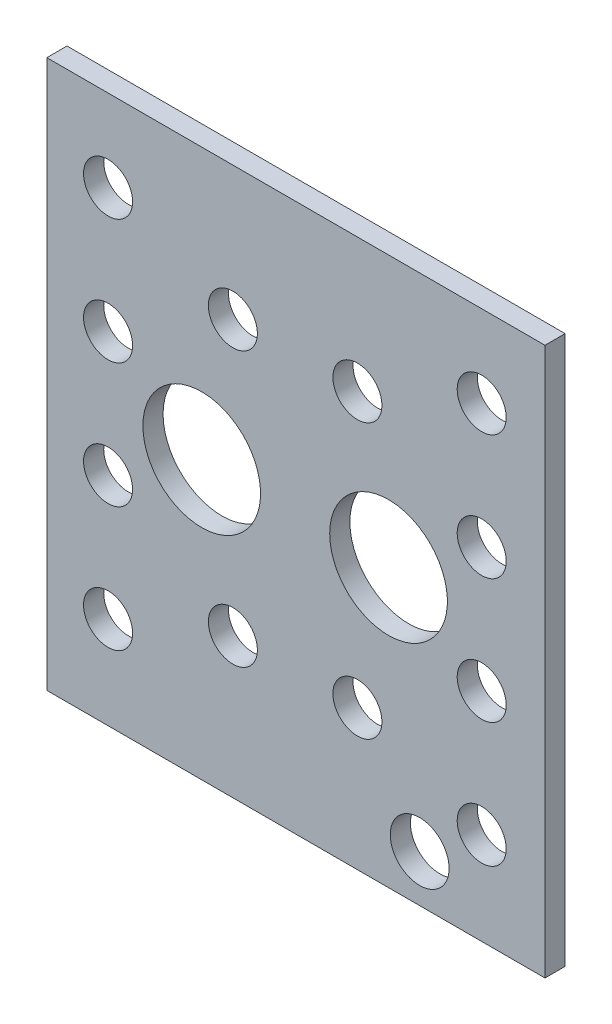
ISO-10303-21;
HEADER;
FILE_DESCRIPTION(('STEP AP214'),'2;1');
FILE_NAME('part.step','',(''),(''),'','','');
FILE_SCHEMA(('AUTOMOTIVE_DESIGN { 1 0 10303 214 1 1 1 1 }'));
ENDSEC;
DATA;
#1=APPLICATION_CONTEXT('core data for automotive mechanical design processes');
#2=APPLICATION_PROTOCOL_DEFINITION('international standard','automotive_design',2000,#1);
#3=PRODUCT_CONTEXT('',#1,'mechanical');
#4=PRODUCT('Part','Part','',(#3));
#5=PRODUCT_RELATED_PRODUCT_CATEGORY('part','',(#4));
#6=PRODUCT_DEFINITION_FORMATION('','',#4);
#7=PRODUCT_DEFINITION_CONTEXT('part definition',#1,'design');
#8=PRODUCT_DEFINITION('design','',#6,#7);
#9=PRODUCT_DEFINITION_SHAPE('','',#8);
#10=(LENGTH_UNIT() NAMED_UNIT(*) SI_UNIT(.MILLI.,.METRE.));
#11=(NAMED_UNIT(*) PLANE_ANGLE_UNIT() SI_UNIT($,.RADIAN.));
#12=(NAMED_UNIT(*) SI_UNIT($,.STERADIAN.) SOLID_ANGLE_UNIT());
#13=UNCERTAINTY_MEASURE_WITH_UNIT(LENGTH_MEASURE(1.E-05),#10,'distance_accuracy_value','');
#14=(GEOMETRIC_REPRESENTATION_CONTEXT(3) GLOBAL_UNCERTAINTY_ASSIGNED_CONTEXT((#13)) GLOBAL_UNIT_ASSIGNED_CONTEXT((#10,
#11,#12)) REPRESENTATION_CONTEXT('',''));
#15=CARTESIAN_POINT('',(0.,0.,0.));
#16=DIRECTION('',(0.,0.,1.));
#17=DIRECTION('',(1.,0.,0.));
#18=AXIS2_PLACEMENT_3D('',#15,#16,#17);
#19=CARTESIAN_POINT('',(-7.112,-5.588,0.));
#20=DIRECTION('',(0.,0.,1.));
#21=DIRECTION('',(1.,0.,0.));
#22=AXIS2_PLACEMENT_3D('',#19,#20,#21);
#23=PLANE('',#22);
#24=CARTESIAN_POINT('',(1.75699928,3.91599928,0.));
#25=DIRECTION('',(0.,0.,-1.));
#26=DIRECTION('',(-1.,0.,0.));
#27=AXIS2_PLACEMENT_3D('',#24,#25,#26);
#28=CIRCLE('',#27,0.499999);
#29=CARTESIAN_POINT('',(1.25700028,3.91599928,0.));
#30=VERTEX_POINT('',#29);
#31=EDGE_CURVE('E126',#30,#30,#28,.T.);
#32=ORIENTED_EDGE('',*,*,#31,.T.);
#33=EDGE_LOOP('',(#32));
#34=FACE_BOUND('',#33,.T.);
#35=CARTESIAN_POINT('',(1.75699928,1.37599928,0.));
#36=DIRECTION('',(0.,0.,-1.));
#37=DIRECTION('',(-1.,0.,0.));
#38=AXIS2_PLACEMENT_3D('',#35,#36,#37);
#39=CIRCLE('',#38,0.499999);
#40=CARTESIAN_POINT('',(1.25700028,1.37599928,0.));
#41=VERTEX_POINT('',#40);
#42=EDGE_CURVE('E129',#41,#41,#39,.T.);
#43=ORIENTED_EDGE('',*,*,#42,.T.);
#44=EDGE_LOOP('',(#43));
#45=FACE_BOUND('',#44,.T.);
#46=CARTESIAN_POINT('',(-0.77799946,2.86100012,0.));
#47=DIRECTION('',(0.,0.,-1.));
#48=DIRECTION('',(-1.,0.,0.));
#49=AXIS2_PLACEMENT_3D('',#46,#47,#48);
#50=CIRCLE('',#49,0.499999);
#51=CARTESIAN_POINT('',(-1.27799846,2.86100012,0.));
#52=VERTEX_POINT('',#51);
#53=EDGE_CURVE('E132',#52,#52,#50,.T.);
#54=ORIENTED_EDGE('',*,*,#53,.T.);
#55=EDGE_LOOP('',(#54));
#56=FACE_BOUND('',#55,.T.);
#57=CARTESIAN_POINT('',(-0.14299946,0.06700012,0.));
#58=DIRECTION('',(0.,0.,-1.));
#59=DIRECTION('',(-1.,0.,0.));
#60=AXIS2_PLACEMENT_3D('',#57,#58,#59);
#61=CIRCLE('',#60,1.20000014);
#62=CARTESIAN_POINT('',(-1.3429996,0.06700012,0.));
#63=VERTEX_POINT('',#62);
#64=EDGE_CURVE('E135',#63,#63,#61,.T.);
#65=ORIENTED_EDGE('',*,*,#64,.T.);
#66=EDGE_LOOP('',(#65));
#67=FACE_BOUND('',#66,.T.);
#68=CARTESIAN_POINT('',(1.75699928,-1.16400072,0.));
#69=DIRECTION('',(0.,0.,-1.));
#70=DIRECTION('',(-1.,0.,0.));
#71=AXIS2_PLACEMENT_3D('',#68,#69,#70);
#72=CIRCLE('',#71,0.499999);
#73=CARTESIAN_POINT('',(1.25700028,-1.16400072,0.));
#74=VERTEX_POINT('',#73);
#75=EDGE_CURVE('E138',#74,#74,#72,.T.);
#76=ORIENTED_EDGE('',*,*,#75,.T.);
#77=EDGE_LOOP('',(#76));
#78=FACE_BOUND('',#77,.T.);
#79=CARTESIAN_POINT('',(1.75699928,-3.70400072,0.));
#80=DIRECTION('',(0.,0.,-1.));
#81=DIRECTION('',(-1.,0.,0.));
#82=AXIS2_PLACEMENT_3D('',#79,#80,#81);
#83=CIRCLE('',#82,0.499999);
#84=CARTESIAN_POINT('',(1.25700028,-3.70400072,0.));
#85=VERTEX_POINT('',#84);
#86=EDGE_CURVE('E141',#85,#85,#83,.T.);
#87=ORIENTED_EDGE('',*,*,#86,.T.);
#88=EDGE_LOOP('',(#87));
#89=FACE_BOUND('',#88,.T.);
#90=CARTESIAN_POINT('',(-0.77799946,-2.72699988,0.));
#91=DIRECTION('',(0.,0.,-1.));
#92=DIRECTION('',(-1.,0.,0.));
#93=AXIS2_PLACEMENT_3D('',#90,#91,#92);
#94=CIRCLE('',#93,0.499999);
#95=CARTESIAN_POINT('',(-1.27799846,-2.72699988,0.));
#96=VERTEX_POINT('',#95);
#97=EDGE_CURVE('E144',#96,#96,#94,.T.);
#98=ORIENTED_EDGE('',*,*,#97,.T.);
#99=EDGE_LOOP('',(#98));
#100=FACE_BOUND('',#99,.T.);
#101=CARTESIAN_POINT('',(0.49200054,-4.63199988,0.));
#102=DIRECTION('',(0.,0.,-1.));
#103=DIRECTION('',(-1.,0.,0.));
#104=AXIS2_PLACEMENT_3D('',#101,#102,#103);
#105=CIRCLE('',#104,0.5999988);
#106=CARTESIAN_POINT('',(-0.10799826,-4.63199988,0.));
#107=VERTEX_POINT('',#106);
#108=EDGE_CURVE('E147',#107,#107,#105,.T.);
#109=ORIENTED_EDGE('',*,*,#108,.T.);
#110=EDGE_LOOP('',(#109));
#111=FACE_BOUND('',#110,.T.);
#112=CARTESIAN_POINT('',(-3.31799946,2.86100012,0.));
#113=DIRECTION('',(0.,0.,-1.));
#114=DIRECTION('',(-1.,0.,0.));
#115=AXIS2_PLACEMENT_3D('',#112,#113,#114);
#116=CIRCLE('',#115,0.499999);
#117=CARTESIAN_POINT('',(-3.81799846,2.86100012,0.));
#118=VERTEX_POINT('',#117);
#119=EDGE_CURVE('E150',#118,#118,#116,.T.);
#120=ORIENTED_EDGE('',*,*,#119,.T.);
#121=EDGE_LOOP('',(#120));
#122=FACE_BOUND('',#121,.T.);
#123=CARTESIAN_POINT('',(-3.95299946,0.06700012,0.));
#124=DIRECTION('',(0.,0.,-1.));
#125=DIRECTION('',(-1.,0.,0.));
#126=AXIS2_PLACEMENT_3D('',#123,#124,#125);
#127=CIRCLE('',#126,1.20000014);
#128=CARTESIAN_POINT('',(-5.1529996,0.06700012,0.));
#129=VERTEX_POINT('',#128);
#130=EDGE_CURVE('E154',#129,#129,#127,.T.);
#131=ORIENTED_EDGE('',*,*,#130,.T.);
#132=EDGE_LOOP('',(#131));
#133=FACE_BOUND('',#132,.T.);
#134=CARTESIAN_POINT('',(-5.86300072,3.91599928,0.));
#135=DIRECTION('',(0.,0.,-1.));
#136=DIRECTION('',(-1.,0.,0.));
#137=AXIS2_PLACEMENT_3D('',#134,#135,#136);
#138=CIRCLE('',#137,0.499999);
#139=CARTESIAN_POINT('',(-6.36299972,3.91599928,0.));
#140=VERTEX_POINT('',#139);
#141=EDGE_CURVE('E157',#140,#140,#138,.T.);
#142=ORIENTED_EDGE('',*,*,#141,.T.);
#143=EDGE_LOOP('',(#142));
#144=FACE_BOUND('',#143,.T.);
#145=CARTESIAN_POINT('',(-5.86300072,1.37599928,0.));
#146=DIRECTION('',(0.,0.,-1.));
#147=DIRECTION('',(-1.,0.,0.));
#148=AXIS2_PLACEMENT_3D('',#145,#146,#147);
#149=CIRCLE('',#148,0.499999);
#150=CARTESIAN_POINT('',(-6.36299972,1.37599928,0.));
#151=VERTEX_POINT('',#150);
#152=EDGE_CURVE('E160',#151,#151,#149,.T.);
#153=ORIENTED_EDGE('',*,*,#152,.T.);
#154=EDGE_LOOP('',(#153));
#155=FACE_BOUND('',#154,.T.);
#156=CARTESIAN_POINT('',(-5.86300072,-1.16400072,0.));
#157=DIRECTION('',(0.,0.,-1.));
#158=DIRECTION('',(-1.,0.,0.));
#159=AXIS2_PLACEMENT_3D('',#156,#157,#158);
#160=CIRCLE('',#159,0.499999);
#161=CARTESIAN_POINT('',(-6.36299972,-1.16400072,0.));
#162=VERTEX_POINT('',#161);
#163=EDGE_CURVE('E163',#162,#162,#160,.T.);
#164=ORIENTED_EDGE('',*,*,#163,.T.);
#165=EDGE_LOOP('',(#164));
#166=FACE_BOUND('',#165,.T.);
#167=CARTESIAN_POINT('',(-3.31799946,-2.72699988,0.));
#168=DIRECTION('',(0.,0.,-1.));
#169=DIRECTION('',(-1.,0.,0.));
#170=AXIS2_PLACEMENT_3D('',#167,#168,#169);
#171=CIRCLE('',#170,0.499999);
#172=CARTESIAN_POINT('',(-3.81799846,-2.72699988,0.));
#173=VERTEX_POINT('',#172);
#174=EDGE_CURVE('E165',#173,#173,#171,.T.);
#175=ORIENTED_EDGE('',*,*,#174,.T.);
#176=EDGE_LOOP('',(#175));
#177=FACE_BOUND('',#176,.T.);
#178=CARTESIAN_POINT('',(-5.86300072,-3.70400072,0.));
#179=DIRECTION('',(0.,0.,-1.));
#180=DIRECTION('',(-1.,0.,0.));
#181=AXIS2_PLACEMENT_3D('',#178,#179,#180);
#182=CIRCLE('',#181,0.499999);
#183=CARTESIAN_POINT('',(-6.36299972,-3.70400072,0.));
#184=VERTEX_POINT('',#183);
#185=EDGE_CURVE('E19',#184,#184,#182,.T.);
#186=ORIENTED_EDGE('',*,*,#185,.T.);
#187=EDGE_LOOP('',(#186));
#188=FACE_BOUND('',#187,.T.);
#189=DIRECTION('',(1.,0.,0.));
#190=VECTOR('',#189,1.);
#191=CARTESIAN_POINT('',(-7.112,5.588,0.));
#192=LINE('',#191,#190);
#193=CARTESIAN_POINT('',(-7.112,5.588,0.));
#194=VERTEX_POINT('',#193);
#195=CARTESIAN_POINT('',(3.048,5.588,0.));
#196=VERTEX_POINT('',#195);
#197=EDGE_CURVE('E53',#194,#196,#192,.T.);
#198=ORIENTED_EDGE('',*,*,#197,.F.);
#199=DIRECTION('',(0.,1.,0.));
#200=VECTOR('',#199,1.);
#201=CARTESIAN_POINT('',(-7.112,-5.588,0.));
#202=LINE('',#201,#200);
#203=CARTESIAN_POINT('',(-7.112,-5.588,0.));
#204=VERTEX_POINT('',#203);
#205=EDGE_CURVE('E70',#204,#194,#202,.T.);
#206=ORIENTED_EDGE('',*,*,#205,.F.);
#207=DIRECTION('',(1.,0.,0.));
#208=VECTOR('',#207,1.);
#209=CARTESIAN_POINT('',(3.048,-5.588,0.));
#210=LINE('',#209,#208);
#211=CARTESIAN_POINT('',(3.048,-5.588,0.));
#212=VERTEX_POINT('',#211);
#213=EDGE_CURVE('E67',#212,#204,#210,.F.);
#214=ORIENTED_EDGE('',*,*,#213,.F.);
#215=DIRECTION('',(0.,1.,0.));
#216=VECTOR('',#215,1.);
#217=CARTESIAN_POINT('',(3.048,5.588,0.));
#218=LINE('',#217,#216);
#219=EDGE_CURVE('E58',#196,#212,#218,.F.);
#220=ORIENTED_EDGE('',*,*,#219,.F.);
#221=EDGE_LOOP('',(#198,#206,#214,#220));
#222=FACE_BOUND('',#221,.T.);
#223=ADVANCED_FACE('F16',(#34,#45,#56,#67,#78,#89,#100,#111,#122,#133,#144,#155,#166,#177,#188,
#222),#23,.T.);
#224=CARTESIAN_POINT('',(3.048,-5.588,-0.41148));
#225=DIRECTION('',(0.,-1.,0.));
#226=DIRECTION('',(0.,0.,-1.));
#227=AXIS2_PLACEMENT_3D('',#224,#225,#226);
#228=PLANE('',#227);
#229=DIRECTION('',(0.,0.,1.));
#230=VECTOR('',#229,1.);
#231=CARTESIAN_POINT('',(-7.112,-5.588,-0.41148));
#232=LINE('',#231,#230);
#233=CARTESIAN_POINT('',(-7.112,-5.588,-0.41148));
#234=VERTEX_POINT('',#233);
#235=EDGE_CURVE('E173',#234,#204,#232,.T.);
#236=ORIENTED_EDGE('',*,*,#235,.F.);
#237=DIRECTION('',(1.,0.,0.));
#238=VECTOR('',#237,1.);
#239=CARTESIAN_POINT('',(-7.112,-5.588,-0.41148));
#240=LINE('',#239,#238);
#241=CARTESIAN_POINT('',(3.048,-5.588,-0.41148));
#242=VERTEX_POINT('',#241);
#243=EDGE_CURVE('E77',#234,#242,#240,.T.);
#244=ORIENTED_EDGE('',*,*,#243,.T.);
#245=DIRECTION('',(0.,0.,-1.));
#246=VECTOR('',#245,1.);
#247=CARTESIAN_POINT('',(3.048,-5.588,-0.41148));
#248=LINE('',#247,#246);
#249=EDGE_CURVE('E63',#212,#242,#248,.T.);
#250=ORIENTED_EDGE('',*,*,#249,.F.);
#251=ORIENTED_EDGE('',*,*,#213,.T.);
#252=EDGE_LOOP('',(#236,#244,#250,#251));
#253=FACE_BOUND('',#252,.T.);
#254=ADVANCED_FACE('F76',(#253),#228,.T.);
#255=CARTESIAN_POINT('',(3.048,5.588,-0.41148));
#256=DIRECTION('',(1.,0.,0.));
#257=DIRECTION('',(0.,0.,-1.));
#258=AXIS2_PLACEMENT_3D('',#255,#256,#257);
#259=PLANE('',#258);
#260=ORIENTED_EDGE('',*,*,#249,.T.);
#261=DIRECTION('',(0.,1.,0.));
#262=VECTOR('',#261,1.);
#263=CARTESIAN_POINT('',(3.048,-5.588,-0.41148));
#264=LINE('',#263,#262);
#265=CARTESIAN_POINT('',(3.048,5.588,-0.41148));
#266=VERTEX_POINT('',#265);
#267=EDGE_CURVE('E184',#242,#266,#264,.T.);
#268=ORIENTED_EDGE('',*,*,#267,.T.);
#269=DIRECTION('',(0.,0.,1.));
#270=VECTOR('',#269,1.);
#271=CARTESIAN_POINT('',(3.048,5.588,-0.41148));
#272=LINE('',#271,#270);
#273=EDGE_CURVE('E65',#196,#266,#272,.F.);
#274=ORIENTED_EDGE('',*,*,#273,.F.);
#275=ORIENTED_EDGE('',*,*,#219,.T.);
#276=EDGE_LOOP('',(#260,#268,#274,#275));
#277=FACE_BOUND('',#276,.T.);
#278=ADVANCED_FACE('F60',(#277),#259,.T.);
#279=CARTESIAN_POINT('',(-7.112,5.588,-0.41148));
#280=DIRECTION('',(0.,1.,0.));
#281=DIRECTION('',(0.,0.,1.));
#282=AXIS2_PLACEMENT_3D('',#279,#280,#281);
#283=PLANE('',#282);
#284=ORIENTED_EDGE('',*,*,#273,.T.);
#285=DIRECTION('',(1.,0.,0.));
#286=VECTOR('',#285,1.);
#287=CARTESIAN_POINT('',(-7.112,5.588,-0.41148));
#288=LINE('',#287,#286);
#289=CARTESIAN_POINT('',(-7.112,5.588,-0.41148));
#290=VERTEX_POINT('',#289);
#291=EDGE_CURVE('E181',#266,#290,#288,.F.);
#292=ORIENTED_EDGE('',*,*,#291,.T.);
#293=DIRECTION('',(0.,0.,1.));
#294=VECTOR('',#293,1.);
#295=CARTESIAN_POINT('',(-7.112,5.588,-0.41148));
#296=LINE('',#295,#294);
#297=EDGE_CURVE('E34',#194,#290,#296,.F.);
#298=ORIENTED_EDGE('',*,*,#297,.F.);
#299=ORIENTED_EDGE('',*,*,#197,.T.);
#300=EDGE_LOOP('',(#284,#292,#298,#299));
#301=FACE_BOUND('',#300,.T.);
#302=ADVANCED_FACE('F180',(#301),#283,.T.);
#303=CARTESIAN_POINT('',(-7.112,-5.588,-0.41148));
#304=DIRECTION('',(-1.,0.,0.));
#305=DIRECTION('',(0.,0.,1.));
#306=AXIS2_PLACEMENT_3D('',#303,#304,#305);
#307=PLANE('',#306);
#308=ORIENTED_EDGE('',*,*,#297,.T.);
#309=DIRECTION('',(0.,1.,0.));
#310=VECTOR('',#309,1.);
#311=CARTESIAN_POINT('',(-7.112,-5.588,-0.41148));
#312=LINE('',#311,#310);
#313=EDGE_CURVE('E125',#290,#234,#312,.F.);
#314=ORIENTED_EDGE('',*,*,#313,.T.);
#315=ORIENTED_EDGE('',*,*,#235,.T.);
#316=ORIENTED_EDGE('',*,*,#205,.T.);
#317=EDGE_LOOP('',(#308,#314,#315,#316));
#318=FACE_BOUND('',#317,.T.);
#319=ADVANCED_FACE('F188',(#318),#307,.T.);
#320=CARTESIAN_POINT('',(-5.86300072,-3.70400072,-0.41148));
#321=DIRECTION('',(0.,0.,-1.));
#322=DIRECTION('',(-1.,0.,0.));
#323=AXIS2_PLACEMENT_3D('',#320,#321,#322);
#324=CYLINDRICAL_SURFACE('',#323,0.499999);
#325=ORIENTED_EDGE('',*,*,#185,.F.);
#326=EDGE_LOOP('',(#325));
#327=FACE_BOUND('',#326,.T.);
#328=CARTESIAN_POINT('',(-5.86300072,-3.70400072,-0.41148));
#329=DIRECTION('',(0.,0.,-1.));
#330=DIRECTION('',(-1.,0.,0.));
#331=AXIS2_PLACEMENT_3D('',#328,#329,#330);
#332=CIRCLE('',#331,0.499999);
#333=CARTESIAN_POINT('',(-6.36299972,-3.70400072,-0.41148));
#334=VERTEX_POINT('',#333);
#335=EDGE_CURVE('E122',#334,#334,#332,.T.);
#336=ORIENTED_EDGE('',*,*,#335,.T.);
#337=EDGE_LOOP('',(#336));
#338=FACE_BOUND('',#337,.T.);
#339=ADVANCED_FACE('F190',(#327,#338),#324,.F.);
#340=CARTESIAN_POINT('',(-3.31799946,-2.72699988,-0.41148));
#341=DIRECTION('',(0.,0.,-1.));
#342=DIRECTION('',(-1.,0.,0.));
#343=AXIS2_PLACEMENT_3D('',#340,#341,#342);
#344=CYLINDRICAL_SURFACE('',#343,0.499999);
#345=ORIENTED_EDGE('',*,*,#174,.F.);
#346=EDGE_LOOP('',(#345));
#347=FACE_BOUND('',#346,.T.);
#348=CARTESIAN_POINT('',(-3.31799946,-2.72699988,-0.41148));
#349=DIRECTION('',(0.,0.,-1.));
#350=DIRECTION('',(-1.,0.,0.));
#351=AXIS2_PLACEMENT_3D('',#348,#349,#350);
#352=CIRCLE('',#351,0.499999);
#353=CARTESIAN_POINT('',(-3.81799846,-2.72699988,-0.41148));
#354=VERTEX_POINT('',#353);
#355=EDGE_CURVE('E119',#354,#354,#352,.T.);
#356=ORIENTED_EDGE('',*,*,#355,.T.);
#357=EDGE_LOOP('',(#356));
#358=FACE_BOUND('',#357,.T.);
#359=ADVANCED_FACE('F197',(#347,#358),#344,.F.);
#360=CARTESIAN_POINT('',(-5.86300072,-1.16400072,-0.41148));
#361=DIRECTION('',(0.,0.,-1.));
#362=DIRECTION('',(-1.,0.,0.));
#363=AXIS2_PLACEMENT_3D('',#360,#361,#362);
#364=CYLINDRICAL_SURFACE('',#363,0.499999);
#365=ORIENTED_EDGE('',*,*,#163,.F.);
#366=EDGE_LOOP('',(#365));
#367=FACE_BOUND('',#366,.T.);
#368=CARTESIAN_POINT('',(-5.86300072,-1.16400072,-0.41148));
#369=DIRECTION('',(0.,0.,-1.));
#370=DIRECTION('',(-1.,0.,0.));
#371=AXIS2_PLACEMENT_3D('',#368,#369,#370);
#372=CIRCLE('',#371,0.499999);
#373=CARTESIAN_POINT('',(-6.36299972,-1.16400072,-0.41148));
#374=VERTEX_POINT('',#373);
#375=EDGE_CURVE('E116',#374,#374,#372,.T.);
#376=ORIENTED_EDGE('',*,*,#375,.T.);
#377=EDGE_LOOP('',(#376));
#378=FACE_BOUND('',#377,.T.);
#379=ADVANCED_FACE('F257',(#367,#378),#364,.F.);
#380=CARTESIAN_POINT('',(-5.86300072,1.37599928,-0.41148));
#381=DIRECTION('',(0.,0.,-1.));
#382=DIRECTION('',(-1.,0.,0.));
#383=AXIS2_PLACEMENT_3D('',#380,#381,#382);
#384=CYLINDRICAL_SURFACE('',#383,0.499999);
#385=ORIENTED_EDGE('',*,*,#152,.F.);
#386=EDGE_LOOP('',(#385));
#387=FACE_BOUND('',#386,.T.);
#388=CARTESIAN_POINT('',(-5.86300072,1.37599928,-0.41148));
#389=DIRECTION('',(0.,0.,-1.));
#390=DIRECTION('',(-1.,0.,0.));
#391=AXIS2_PLACEMENT_3D('',#388,#389,#390);
#392=CIRCLE('',#391,0.499999);
#393=CARTESIAN_POINT('',(-6.36299972,1.37599928,-0.41148));
#394=VERTEX_POINT('',#393);
#395=EDGE_CURVE('E113',#394,#394,#392,.T.);
#396=ORIENTED_EDGE('',*,*,#395,.T.);
#397=EDGE_LOOP('',(#396));
#398=FACE_BOUND('',#397,.T.);
#399=ADVANCED_FACE('F253',(#387,#398),#384,.F.);
#400=CARTESIAN_POINT('',(-5.86300072,3.91599928,-0.41148));
#401=DIRECTION('',(0.,0.,-1.));
#402=DIRECTION('',(-1.,0.,0.));
#403=AXIS2_PLACEMENT_3D('',#400,#401,#402);
#404=CYLINDRICAL_SURFACE('',#403,0.499999);
#405=ORIENTED_EDGE('',*,*,#141,.F.);
#406=EDGE_LOOP('',(#405));
#407=FACE_BOUND('',#406,.T.);
#408=CARTESIAN_POINT('',(-5.86300072,3.91599928,-0.41148));
#409=DIRECTION('',(0.,0.,-1.));
#410=DIRECTION('',(-1.,0.,0.));
#411=AXIS2_PLACEMENT_3D('',#408,#409,#410);
#412=CIRCLE('',#411,0.499999);
#413=CARTESIAN_POINT('',(-6.36299972,3.91599928,-0.41148));
#414=VERTEX_POINT('',#413);
#415=EDGE_CURVE('E110',#414,#414,#412,.T.);
#416=ORIENTED_EDGE('',*,*,#415,.T.);
#417=EDGE_LOOP('',(#416));
#418=FACE_BOUND('',#417,.T.);
#419=ADVANCED_FACE('F249',(#407,#418),#404,.F.);
#420=CARTESIAN_POINT('',(-3.95299946,0.06700012,-0.41148));
#421=DIRECTION('',(0.,0.,-1.));
#422=DIRECTION('',(-1.,0.,0.));
#423=AXIS2_PLACEMENT_3D('',#420,#421,#422);
#424=CYLINDRICAL_SURFACE('',#423,1.20000014);
#425=ORIENTED_EDGE('',*,*,#130,.F.);
#426=EDGE_LOOP('',(#425));
#427=FACE_BOUND('',#426,.T.);
#428=CARTESIAN_POINT('',(-3.95299946,0.06700012,-0.41148));
#429=DIRECTION('',(0.,0.,-1.));
#430=DIRECTION('',(-1.,0.,0.));
#431=AXIS2_PLACEMENT_3D('',#428,#429,#430);
#432=CIRCLE('',#431,1.20000014);
#433=CARTESIAN_POINT('',(-5.1529996,0.06700012,-0.41148));
#434=VERTEX_POINT('',#433);
#435=EDGE_CURVE('E107',#434,#434,#432,.T.);
#436=ORIENTED_EDGE('',*,*,#435,.T.);
#437=EDGE_LOOP('',(#436));
#438=FACE_BOUND('',#437,.T.);
#439=ADVANCED_FACE('F245',(#427,#438),#424,.F.);
#440=CARTESIAN_POINT('',(-3.31799946,2.86100012,-0.41148));
#441=DIRECTION('',(0.,0.,-1.));
#442=DIRECTION('',(-1.,0.,0.));
#443=AXIS2_PLACEMENT_3D('',#440,#441,#442);
#444=CYLINDRICAL_SURFACE('',#443,0.499999);
#445=ORIENTED_EDGE('',*,*,#119,.F.);
#446=EDGE_LOOP('',(#445));
#447=FACE_BOUND('',#446,.T.);
#448=CARTESIAN_POINT('',(-3.31799946,2.86100012,-0.41148));
#449=DIRECTION('',(0.,0.,-1.));
#450=DIRECTION('',(-1.,0.,0.));
#451=AXIS2_PLACEMENT_3D('',#448,#449,#450);
#452=CIRCLE('',#451,0.499999);
#453=CARTESIAN_POINT('',(-3.81799846,2.86100012,-0.41148));
#454=VERTEX_POINT('',#453);
#455=EDGE_CURVE('E103',#454,#454,#452,.T.);
#456=ORIENTED_EDGE('',*,*,#455,.T.);
#457=EDGE_LOOP('',(#456));
#458=FACE_BOUND('',#457,.T.);
#459=ADVANCED_FACE('F241',(#447,#458),#444,.F.);
#460=CARTESIAN_POINT('',(0.49200054,-4.63199988,-0.41148));
#461=DIRECTION('',(0.,0.,-1.));
#462=DIRECTION('',(-1.,0.,0.));
#463=AXIS2_PLACEMENT_3D('',#460,#461,#462);
#464=CYLINDRICAL_SURFACE('',#463,0.5999988);
#465=ORIENTED_EDGE('',*,*,#108,.F.);
#466=EDGE_LOOP('',(#465));
#467=FACE_BOUND('',#466,.T.);
#468=CARTESIAN_POINT('',(0.49200054,-4.63199988,-0.41148));
#469=DIRECTION('',(0.,0.,-1.));
#470=DIRECTION('',(-1.,0.,0.));
#471=AXIS2_PLACEMENT_3D('',#468,#469,#470);
#472=CIRCLE('',#471,0.5999988);
#473=CARTESIAN_POINT('',(-0.10799826,-4.63199988,-0.41148));
#474=VERTEX_POINT('',#473);
#475=EDGE_CURVE('E100',#474,#474,#472,.T.);
#476=ORIENTED_EDGE('',*,*,#475,.T.);
#477=EDGE_LOOP('',(#476));
#478=FACE_BOUND('',#477,.T.);
#479=ADVANCED_FACE('F237',(#467,#478),#464,.F.);
#480=CARTESIAN_POINT('',(-0.77799946,-2.72699988,-0.41148));
#481=DIRECTION('',(0.,0.,-1.));
#482=DIRECTION('',(-1.,0.,0.));
#483=AXIS2_PLACEMENT_3D('',#480,#481,#482);
#484=CYLINDRICAL_SURFACE('',#483,0.499999);
#485=ORIENTED_EDGE('',*,*,#97,.F.);
#486=EDGE_LOOP('',(#485));
#487=FACE_BOUND('',#486,.T.);
#488=CARTESIAN_POINT('',(-0.77799946,-2.72699988,-0.41148));
#489=DIRECTION('',(0.,0.,-1.));
#490=DIRECTION('',(-1.,0.,0.));
#491=AXIS2_PLACEMENT_3D('',#488,#489,#490);
#492=CIRCLE('',#491,0.499999);
#493=CARTESIAN_POINT('',(-1.27799846,-2.72699988,-0.41148));
#494=VERTEX_POINT('',#493);
#495=EDGE_CURVE('E97',#494,#494,#492,.T.);
#496=ORIENTED_EDGE('',*,*,#495,.T.);
#497=EDGE_LOOP('',(#496));
#498=FACE_BOUND('',#497,.T.);
#499=ADVANCED_FACE('F233',(#487,#498),#484,.F.);
#500=CARTESIAN_POINT('',(1.75699928,-3.70400072,-0.41148));
#501=DIRECTION('',(0.,0.,-1.));
#502=DIRECTION('',(-1.,0.,0.));
#503=AXIS2_PLACEMENT_3D('',#500,#501,#502);
#504=CYLINDRICAL_SURFACE('',#503,0.499999);
#505=ORIENTED_EDGE('',*,*,#86,.F.);
#506=EDGE_LOOP('',(#505));
#507=FACE_BOUND('',#506,.T.);
#508=CARTESIAN_POINT('',(1.75699928,-3.70400072,-0.41148));
#509=DIRECTION('',(0.,0.,-1.));
#510=DIRECTION('',(-1.,0.,0.));
#511=AXIS2_PLACEMENT_3D('',#508,#509,#510);
#512=CIRCLE('',#511,0.499999);
#513=CARTESIAN_POINT('',(1.25700028,-3.70400072,-0.41148));
#514=VERTEX_POINT('',#513);
#515=EDGE_CURVE('E94',#514,#514,#512,.T.);
#516=ORIENTED_EDGE('',*,*,#515,.T.);
#517=EDGE_LOOP('',(#516));
#518=FACE_BOUND('',#517,.T.);
#519=ADVANCED_FACE('F229',(#507,#518),#504,.F.);
#520=CARTESIAN_POINT('',(1.75699928,-1.16400072,-0.41148));
#521=DIRECTION('',(0.,0.,-1.));
#522=DIRECTION('',(-1.,0.,0.));
#523=AXIS2_PLACEMENT_3D('',#520,#521,#522);
#524=CYLINDRICAL_SURFACE('',#523,0.499999);
#525=ORIENTED_EDGE('',*,*,#75,.F.);
#526=EDGE_LOOP('',(#525));
#527=FACE_BOUND('',#526,.T.);
#528=CARTESIAN_POINT('',(1.75699928,-1.16400072,-0.41148));
#529=DIRECTION('',(0.,0.,-1.));
#530=DIRECTION('',(-1.,0.,0.));
#531=AXIS2_PLACEMENT_3D('',#528,#529,#530);
#532=CIRCLE('',#531,0.499999);
#533=CARTESIAN_POINT('',(1.25700028,-1.16400072,-0.41148));
#534=VERTEX_POINT('',#533);
#535=EDGE_CURVE('E91',#534,#534,#532,.T.);
#536=ORIENTED_EDGE('',*,*,#535,.T.);
#537=EDGE_LOOP('',(#536));
#538=FACE_BOUND('',#537,.T.);
#539=ADVANCED_FACE('F225',(#527,#538),#524,.F.);
#540=CARTESIAN_POINT('',(-0.14299946,0.06700012,-0.41148));
#541=DIRECTION('',(0.,0.,-1.));
#542=DIRECTION('',(-1.,0.,0.));
#543=AXIS2_PLACEMENT_3D('',#540,#541,#542);
#544=CYLINDRICAL_SURFACE('',#543,1.20000014);
#545=ORIENTED_EDGE('',*,*,#64,.F.);
#546=EDGE_LOOP('',(#545));
#547=FACE_BOUND('',#546,.T.);
#548=CARTESIAN_POINT('',(-0.14299946,0.06700012,-0.41148));
#549=DIRECTION('',(0.,0.,-1.));
#550=DIRECTION('',(-1.,0.,0.));
#551=AXIS2_PLACEMENT_3D('',#548,#549,#550);
#552=CIRCLE('',#551,1.20000014);
#553=CARTESIAN_POINT('',(-1.3429996,0.06700012,-0.41148));
#554=VERTEX_POINT('',#553);
#555=EDGE_CURVE('E88',#554,#554,#552,.T.);
#556=ORIENTED_EDGE('',*,*,#555,.T.);
#557=EDGE_LOOP('',(#556));
#558=FACE_BOUND('',#557,.T.);
#559=ADVANCED_FACE('F221',(#547,#558),#544,.F.);
#560=CARTESIAN_POINT('',(-0.77799946,2.86100012,-0.41148));
#561=DIRECTION('',(0.,0.,-1.));
#562=DIRECTION('',(-1.,0.,0.));
#563=AXIS2_PLACEMENT_3D('',#560,#561,#562);
#564=CYLINDRICAL_SURFACE('',#563,0.499999);
#565=ORIENTED_EDGE('',*,*,#53,.F.);
#566=EDGE_LOOP('',(#565));
#567=FACE_BOUND('',#566,.T.);
#568=CARTESIAN_POINT('',(-0.77799946,2.86100012,-0.41148));
#569=DIRECTION('',(0.,0.,-1.));
#570=DIRECTION('',(-1.,0.,0.));
#571=AXIS2_PLACEMENT_3D('',#568,#569,#570);
#572=CIRCLE('',#571,0.499999);
#573=CARTESIAN_POINT('',(-1.27799846,2.86100012,-0.41148));
#574=VERTEX_POINT('',#573);
#575=EDGE_CURVE('E85',#574,#574,#572,.T.);
#576=ORIENTED_EDGE('',*,*,#575,.T.);
#577=EDGE_LOOP('',(#576));
#578=FACE_BOUND('',#577,.T.);
#579=ADVANCED_FACE('F217',(#567,#578),#564,.F.);
#580=CARTESIAN_POINT('',(1.75699928,1.37599928,-0.41148));
#581=DIRECTION('',(0.,0.,-1.));
#582=DIRECTION('',(-1.,0.,0.));
#583=AXIS2_PLACEMENT_3D('',#580,#581,#582);
#584=CYLINDRICAL_SURFACE('',#583,0.499999);
#585=ORIENTED_EDGE('',*,*,#42,.F.);
#586=EDGE_LOOP('',(#585));
#587=FACE_BOUND('',#586,.T.);
#588=CARTESIAN_POINT('',(1.75699928,1.37599928,-0.41148));
#589=DIRECTION('',(0.,0.,-1.));
#590=DIRECTION('',(-1.,0.,0.));
#591=AXIS2_PLACEMENT_3D('',#588,#589,#590);
#592=CIRCLE('',#591,0.499999);
#593=CARTESIAN_POINT('',(1.25700028,1.37599928,-0.41148));
#594=VERTEX_POINT('',#593);
#595=EDGE_CURVE('E25',#594,#594,#592,.T.);
#596=ORIENTED_EDGE('',*,*,#595,.T.);
#597=EDGE_LOOP('',(#596));
#598=FACE_BOUND('',#597,.T.);
#599=ADVANCED_FACE('F209',(#587,#598),#584,.F.);
#600=CARTESIAN_POINT('',(1.75699928,3.91599928,-0.41148));
#601=DIRECTION('',(0.,0.,-1.));
#602=DIRECTION('',(-1.,0.,0.));
#603=AXIS2_PLACEMENT_3D('',#600,#601,#602);
#604=CYLINDRICAL_SURFACE('',#603,0.499999);
#605=ORIENTED_EDGE('',*,*,#31,.F.);
#606=EDGE_LOOP('',(#605));
#607=FACE_BOUND('',#606,.T.);
#608=CARTESIAN_POINT('',(1.75699928,3.91599928,-0.41148));
#609=DIRECTION('',(0.,0.,-1.));
#610=DIRECTION('',(-1.,0.,0.));
#611=AXIS2_PLACEMENT_3D('',#608,#609,#610);
#612=CIRCLE('',#611,0.499999);
#613=CARTESIAN_POINT('',(1.25700028,3.91599928,-0.41148));
#614=VERTEX_POINT('',#613);
#615=EDGE_CURVE('E11',#614,#614,#612,.T.);
#616=ORIENTED_EDGE('',*,*,#615,.T.);
#617=EDGE_LOOP('',(#616));
#618=FACE_BOUND('',#617,.T.);
#619=ADVANCED_FACE('F202',(#607,#618),#604,.F.);
#620=CARTESIAN_POINT('',(-7.112,-5.588,-0.41148));
#621=DIRECTION('',(0.,0.,1.));
#622=DIRECTION('',(1.,0.,0.));
#623=AXIS2_PLACEMENT_3D('',#620,#621,#622);
#624=PLANE('',#623);
#625=ORIENTED_EDGE('',*,*,#615,.F.);
#626=EDGE_LOOP('',(#625));
#627=FACE_BOUND('',#626,.T.);
#628=ORIENTED_EDGE('',*,*,#595,.F.);
#629=EDGE_LOOP('',(#628));
#630=FACE_BOUND('',#629,.T.);
#631=ORIENTED_EDGE('',*,*,#575,.F.);
#632=EDGE_LOOP('',(#631));
#633=FACE_BOUND('',#632,.T.);
#634=ORIENTED_EDGE('',*,*,#555,.F.);
#635=EDGE_LOOP('',(#634));
#636=FACE_BOUND('',#635,.T.);
#637=ORIENTED_EDGE('',*,*,#535,.F.);
#638=EDGE_LOOP('',(#637));
#639=FACE_BOUND('',#638,.T.);
#640=ORIENTED_EDGE('',*,*,#515,.F.);
#641=EDGE_LOOP('',(#640));
#642=FACE_BOUND('',#641,.T.);
#643=ORIENTED_EDGE('',*,*,#495,.F.);
#644=EDGE_LOOP('',(#643));
#645=FACE_BOUND('',#644,.T.);
#646=ORIENTED_EDGE('',*,*,#475,.F.);
#647=EDGE_LOOP('',(#646));
#648=FACE_BOUND('',#647,.T.);
#649=ORIENTED_EDGE('',*,*,#455,.F.);
#650=EDGE_LOOP('',(#649));
#651=FACE_BOUND('',#650,.T.);
#652=ORIENTED_EDGE('',*,*,#435,.F.);
#653=EDGE_LOOP('',(#652));
#654=FACE_BOUND('',#653,.T.);
#655=ORIENTED_EDGE('',*,*,#415,.F.);
#656=EDGE_LOOP('',(#655));
#657=FACE_BOUND('',#656,.T.);
#658=ORIENTED_EDGE('',*,*,#395,.F.);
#659=EDGE_LOOP('',(#658));
#660=FACE_BOUND('',#659,.T.);
#661=ORIENTED_EDGE('',*,*,#375,.F.);
#662=EDGE_LOOP('',(#661));
#663=FACE_BOUND('',#662,.T.);
#664=ORIENTED_EDGE('',*,*,#355,.F.);
#665=EDGE_LOOP('',(#664));
#666=FACE_BOUND('',#665,.T.);
#667=ORIENTED_EDGE('',*,*,#335,.F.);
#668=EDGE_LOOP('',(#667));
#669=FACE_BOUND('',#668,.T.);
#670=ORIENTED_EDGE('',*,*,#291,.F.);
#671=ORIENTED_EDGE('',*,*,#267,.F.);
#672=ORIENTED_EDGE('',*,*,#243,.F.);
#673=ORIENTED_EDGE('',*,*,#313,.F.);
#674=EDGE_LOOP('',(#670,#671,#672,#673));
#675=FACE_BOUND('',#674,.T.);
#676=ADVANCED_FACE('F183',(#627,#630,#633,#636,#639,#642,#645,#648,#651,#654,#657,#660,#663,
#666,#669,#675),#624,.F.);
#677=CLOSED_SHELL('',(#223,#254,#278,#302,#319,#339,#359,#379,#399,#419,#439,#459,#479,#499,
#519,#539,#559,#579,#599,#619,#676));
#678=MANIFOLD_SOLID_BREP('B1',#677);
#679=ADVANCED_BREP_SHAPE_REPRESENTATION('',(#18,#678),#14);
#680=SHAPE_DEFINITION_REPRESENTATION(#9,#679);
ENDSEC;
END-ISO-10303-21;
